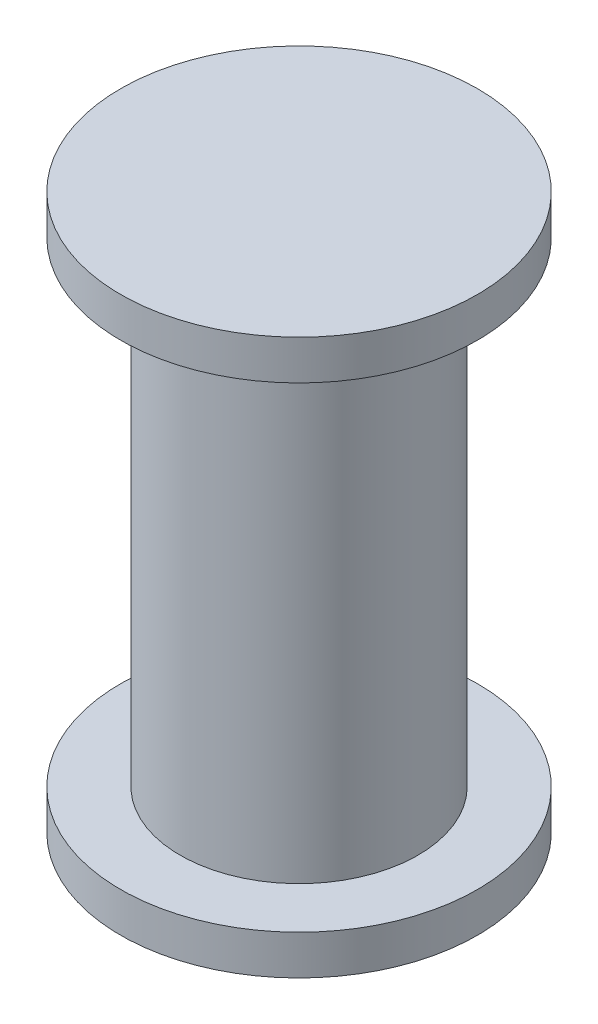
ISO-10303-21;
HEADER;
FILE_DESCRIPTION(('STEP AP214'),'2;1');
FILE_NAME('part.step','',(''),(''),'','','');
FILE_SCHEMA(('AUTOMOTIVE_DESIGN { 1 0 10303 214 1 1 1 1 }'));
ENDSEC;
DATA;
#1=APPLICATION_CONTEXT('core data for automotive mechanical design processes');
#2=APPLICATION_PROTOCOL_DEFINITION('international standard','automotive_design',2000,#1);
#3=PRODUCT_CONTEXT('',#1,'mechanical');
#4=PRODUCT('Part','Part','',(#3));
#5=PRODUCT_RELATED_PRODUCT_CATEGORY('part','',(#4));
#6=PRODUCT_DEFINITION_FORMATION('','',#4);
#7=PRODUCT_DEFINITION_CONTEXT('part definition',#1,'design');
#8=PRODUCT_DEFINITION('design','',#6,#7);
#9=PRODUCT_DEFINITION_SHAPE('','',#8);
#10=(LENGTH_UNIT() NAMED_UNIT(*) SI_UNIT(.MILLI.,.METRE.));
#11=(NAMED_UNIT(*) PLANE_ANGLE_UNIT() SI_UNIT($,.RADIAN.));
#12=(NAMED_UNIT(*) SI_UNIT($,.STERADIAN.) SOLID_ANGLE_UNIT());
#13=UNCERTAINTY_MEASURE_WITH_UNIT(LENGTH_MEASURE(1.E-05),#10,'distance_accuracy_value','');
#14=(GEOMETRIC_REPRESENTATION_CONTEXT(3) GLOBAL_UNCERTAINTY_ASSIGNED_CONTEXT((#13)) GLOBAL_UNIT_ASSIGNED_CONTEXT((#10,
#11,#12)) REPRESENTATION_CONTEXT('',''));
#15=CARTESIAN_POINT('',(0.,0.,0.));
#16=DIRECTION('',(0.,0.,1.));
#17=DIRECTION('',(1.,0.,0.));
#18=AXIS2_PLACEMENT_3D('',#15,#16,#17);
#19=CARTESIAN_POINT('',(-4.5,0.,0.));
#20=DIRECTION('',(0.,1.,0.));
#21=DIRECTION('',(0.,0.,1.));
#22=AXIS2_PLACEMENT_3D('',#19,#20,#21);
#23=PLANE('',#22);
#24=CARTESIAN_POINT('',(0.,0.,0.));
#25=DIRECTION('',(0.,-1.,0.));
#26=DIRECTION('',(0.,0.,-1.));
#27=AXIS2_PLACEMENT_3D('',#24,#25,#26);
#28=CIRCLE('',#27,4.5);
#29=CARTESIAN_POINT('',(0.,0.,-4.5));
#30=VERTEX_POINT('',#29);
#31=EDGE_CURVE('E64',#30,#30,#28,.T.);
#32=ORIENTED_EDGE('',*,*,#31,.T.);
#33=EDGE_LOOP('',(#32));
#34=FACE_BOUND('',#33,.T.);
#35=ADVANCED_FACE('F37',(#34),#23,.F.);
#36=CARTESIAN_POINT('',(0.,14.,0.));
#37=DIRECTION('',(0.,-1.,0.));
#38=DIRECTION('',(0.,0.,-1.));
#39=AXIS2_PLACEMENT_3D('',#36,#37,#38);
#40=PLANE('',#39);
#41=CARTESIAN_POINT('',(0.,14.,0.));
#42=DIRECTION('',(0.,-1.,0.));
#43=DIRECTION('',(0.,0.,-1.));
#44=AXIS2_PLACEMENT_3D('',#41,#42,#43);
#45=CIRCLE('',#44,4.5);
#46=CARTESIAN_POINT('',(0.,14.,-4.5));
#47=VERTEX_POINT('',#46);
#48=EDGE_CURVE('E10',#47,#47,#45,.T.);
#49=ORIENTED_EDGE('',*,*,#48,.F.);
#50=EDGE_LOOP('',(#49));
#51=FACE_BOUND('',#50,.T.);
#52=ADVANCED_FACE('F95',(#51),#40,.F.);
#53=CARTESIAN_POINT('',(0.,0.,0.));
#54=DIRECTION('',(0.,-1.,0.));
#55=DIRECTION('',(0.,0.,-1.));
#56=AXIS2_PLACEMENT_3D('',#53,#54,#55);
#57=CYLINDRICAL_SURFACE('',#56,4.5);
#58=CARTESIAN_POINT('',(0.,13.,0.));
#59=DIRECTION('',(0.,-1.,0.));
#60=DIRECTION('',(0.,0.,-1.));
#61=AXIS2_PLACEMENT_3D('',#58,#59,#60);
#62=CIRCLE('',#61,4.5);
#63=CARTESIAN_POINT('',(0.,13.,-4.5));
#64=VERTEX_POINT('',#63);
#65=EDGE_CURVE('E44',#64,#64,#62,.T.);
#66=ORIENTED_EDGE('',*,*,#65,.F.);
#67=EDGE_LOOP('',(#66));
#68=FACE_BOUND('',#67,.T.);
#69=ORIENTED_EDGE('',*,*,#48,.T.);
#70=EDGE_LOOP('',(#69));
#71=FACE_BOUND('',#70,.T.);
#72=ADVANCED_FACE('F90',(#68,#71),#57,.T.);
#73=CARTESIAN_POINT('',(-4.5,13.,0.));
#74=DIRECTION('',(0.,1.,0.));
#75=DIRECTION('',(0.,0.,1.));
#76=AXIS2_PLACEMENT_3D('',#73,#74,#75);
#77=PLANE('',#76);
#78=CARTESIAN_POINT('',(0.,13.,0.));
#79=DIRECTION('',(0.,-1.,0.));
#80=DIRECTION('',(0.,0.,-1.));
#81=AXIS2_PLACEMENT_3D('',#78,#79,#80);
#82=CIRCLE('',#81,3.);
#83=CARTESIAN_POINT('',(0.,13.,-3.));
#84=VERTEX_POINT('',#83);
#85=EDGE_CURVE('E49',#84,#84,#82,.T.);
#86=ORIENTED_EDGE('',*,*,#85,.F.);
#87=EDGE_LOOP('',(#86));
#88=FACE_BOUND('',#87,.T.);
#89=ORIENTED_EDGE('',*,*,#65,.T.);
#90=EDGE_LOOP('',(#89));
#91=FACE_BOUND('',#90,.T.);
#92=ADVANCED_FACE('F85',(#88,#91),#77,.F.);
#93=CARTESIAN_POINT('',(0.,0.,0.));
#94=DIRECTION('',(0.,-1.,0.));
#95=DIRECTION('',(0.,0.,-1.));
#96=AXIS2_PLACEMENT_3D('',#93,#94,#95);
#97=CYLINDRICAL_SURFACE('',#96,3.);
#98=CARTESIAN_POINT('',(0.,1.,0.));
#99=DIRECTION('',(0.,-1.,0.));
#100=DIRECTION('',(0.,0.,-1.));
#101=AXIS2_PLACEMENT_3D('',#98,#99,#100);
#102=CIRCLE('',#101,3.);
#103=CARTESIAN_POINT('',(0.,1.,-3.));
#104=VERTEX_POINT('',#103);
#105=EDGE_CURVE('E54',#104,#104,#102,.T.);
#106=ORIENTED_EDGE('',*,*,#105,.F.);
#107=EDGE_LOOP('',(#106));
#108=FACE_BOUND('',#107,.T.);
#109=ORIENTED_EDGE('',*,*,#85,.T.);
#110=EDGE_LOOP('',(#109));
#111=FACE_BOUND('',#110,.T.);
#112=ADVANCED_FACE('F79',(#108,#111),#97,.T.);
#113=CARTESIAN_POINT('',(-3.,1.,0.));
#114=DIRECTION('',(0.,-1.,0.));
#115=DIRECTION('',(0.,0.,-1.));
#116=AXIS2_PLACEMENT_3D('',#113,#114,#115);
#117=PLANE('',#116);
#118=CARTESIAN_POINT('',(0.,1.,0.));
#119=DIRECTION('',(0.,-1.,0.));
#120=DIRECTION('',(0.,0.,-1.));
#121=AXIS2_PLACEMENT_3D('',#118,#119,#120);
#122=CIRCLE('',#121,4.5);
#123=CARTESIAN_POINT('',(0.,1.,-4.5));
#124=VERTEX_POINT('',#123);
#125=EDGE_CURVE('E60',#124,#124,#122,.T.);
#126=ORIENTED_EDGE('',*,*,#125,.F.);
#127=EDGE_LOOP('',(#126));
#128=FACE_BOUND('',#127,.T.);
#129=ORIENTED_EDGE('',*,*,#105,.T.);
#130=EDGE_LOOP('',(#129));
#131=FACE_BOUND('',#130,.T.);
#132=ADVANCED_FACE('F73',(#128,#131),#117,.F.);
#133=CARTESIAN_POINT('',(0.,0.,0.));
#134=DIRECTION('',(0.,-1.,0.));
#135=DIRECTION('',(0.,0.,-1.));
#136=AXIS2_PLACEMENT_3D('',#133,#134,#135);
#137=CYLINDRICAL_SURFACE('',#136,4.5);
#138=ORIENTED_EDGE('',*,*,#31,.F.);
#139=EDGE_LOOP('',(#138));
#140=FACE_BOUND('',#139,.T.);
#141=ORIENTED_EDGE('',*,*,#125,.T.);
#142=EDGE_LOOP('',(#141));
#143=FACE_BOUND('',#142,.T.);
#144=ADVANCED_FACE('F70',(#140,#143),#137,.T.);
#145=CLOSED_SHELL('',(#35,#52,#72,#92,#112,#132,#144));
#146=MANIFOLD_SOLID_BREP('B2',#145);
#147=ADVANCED_BREP_SHAPE_REPRESENTATION('',(#18,#146),#14);
#148=SHAPE_DEFINITION_REPRESENTATION(#9,#147);
ENDSEC;
END-ISO-10303-21;
